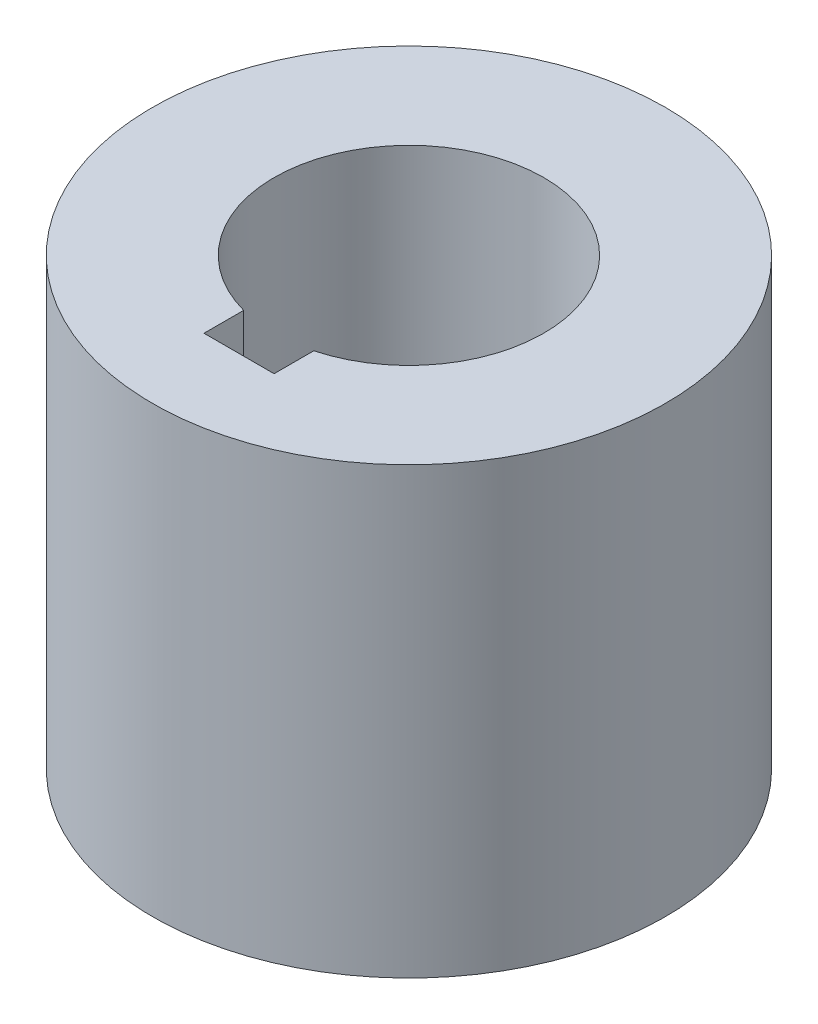
ISO-10303-21;
HEADER;
FILE_DESCRIPTION(('STEP AP214'),'2;1');
FILE_NAME('part.step','',(''),(''),'','','');
FILE_SCHEMA(('AUTOMOTIVE_DESIGN { 1 0 10303 214 1 1 1 1 }'));
ENDSEC;
DATA;
#1=APPLICATION_CONTEXT('core data for automotive mechanical design processes');
#2=APPLICATION_PROTOCOL_DEFINITION('international standard','automotive_design',2000,#1);
#3=PRODUCT_CONTEXT('',#1,'mechanical');
#4=PRODUCT('Part','Part','',(#3));
#5=PRODUCT_RELATED_PRODUCT_CATEGORY('part','',(#4));
#6=PRODUCT_DEFINITION_FORMATION('','',#4);
#7=PRODUCT_DEFINITION_CONTEXT('part definition',#1,'design');
#8=PRODUCT_DEFINITION('design','',#6,#7);
#9=PRODUCT_DEFINITION_SHAPE('','',#8);
#10=(LENGTH_UNIT() NAMED_UNIT(*) SI_UNIT(.MILLI.,.METRE.));
#11=(NAMED_UNIT(*) PLANE_ANGLE_UNIT() SI_UNIT($,.RADIAN.));
#12=(NAMED_UNIT(*) SI_UNIT($,.STERADIAN.) SOLID_ANGLE_UNIT());
#13=UNCERTAINTY_MEASURE_WITH_UNIT(LENGTH_MEASURE(1.E-05),#10,'distance_accuracy_value','');
#14=(GEOMETRIC_REPRESENTATION_CONTEXT(3) GLOBAL_UNCERTAINTY_ASSIGNED_CONTEXT((#13)) GLOBAL_UNIT_ASSIGNED_CONTEXT((#10,
#11,#12)) REPRESENTATION_CONTEXT('',''));
#15=CARTESIAN_POINT('',(0.,0.,0.));
#16=DIRECTION('',(0.,0.,1.));
#17=DIRECTION('',(1.,0.,0.));
#18=AXIS2_PLACEMENT_3D('',#15,#16,#17);
#19=CARTESIAN_POINT('',(-1.0414,12.0697859789974,5.04825000000001));
#20=DIRECTION('',(-1.,0.,0.));
#21=DIRECTION('',(0.,0.,1.));
#22=AXIS2_PLACEMENT_3D('',#19,#20,#21);
#23=PLANE('',#22);
#24=DIRECTION('',(0.,1.,0.));
#25=VECTOR('',#24,1.);
#26=CARTESIAN_POINT('',(-1.0414,12.0697859789974,5.04825000000001));
#27=LINE('',#26,#25);
#28=CARTESIAN_POINT('',(-1.0414,0.,5.04825000000001));
#29=VERTEX_POINT('',#28);
#30=CARTESIAN_POINT('',(-1.0414,-13.208,5.04825000000001));
#31=VERTEX_POINT('',#30);
#32=EDGE_CURVE('E60',#29,#31,#27,.F.);
#33=ORIENTED_EDGE('',*,*,#32,.T.);
#34=DIRECTION('',(0.,0.,1.));
#35=VECTOR('',#34,1.);
#36=CARTESIAN_POINT('',(-1.0414,-13.208,5.04825000000001));
#37=LINE('',#36,#35);
#38=CARTESIAN_POINT('',(-1.0414,-13.208,3.86915145251514));
#39=VERTEX_POINT('',#38);
#40=EDGE_CURVE('E55',#39,#31,#37,.T.);
#41=ORIENTED_EDGE('',*,*,#40,.F.);
#42=DIRECTION('',(0.,-1.,0.));
#43=VECTOR('',#42,1.);
#44=CARTESIAN_POINT('',(-1.0414,-13.208,3.86915145251514));
#45=LINE('',#44,#43);
#46=CARTESIAN_POINT('',(-1.0414,0.,3.86915145251514));
#47=VERTEX_POINT('',#46);
#48=EDGE_CURVE('E57',#39,#47,#45,.F.);
#49=ORIENTED_EDGE('',*,*,#48,.T.);
#50=DIRECTION('',(0.,0.,1.));
#51=VECTOR('',#50,1.);
#52=CARTESIAN_POINT('',(-1.0414,0.,5.04825000000001));
#53=LINE('',#52,#51);
#54=EDGE_CURVE('E65',#29,#47,#53,.F.);
#55=ORIENTED_EDGE('',*,*,#54,.F.);
#56=EDGE_LOOP('',(#33,#41,#49,#55));
#57=FACE_BOUND('',#56,.T.);
#58=ADVANCED_FACE('F17',(#57),#23,.F.);
#59=CARTESIAN_POINT('',(1.0414,12.0697859789974,0.));
#60=DIRECTION('',(1.,0.,0.));
#61=DIRECTION('',(0.,0.,-1.));
#62=AXIS2_PLACEMENT_3D('',#59,#60,#61);
#63=PLANE('',#62);
#64=DIRECTION('',(0.,-1.,0.));
#65=VECTOR('',#64,1.);
#66=CARTESIAN_POINT('',(1.0414,-13.208,3.86915145251514));
#67=LINE('',#66,#65);
#68=CARTESIAN_POINT('',(1.0414,0.,3.86915145251514));
#69=VERTEX_POINT('',#68);
#70=CARTESIAN_POINT('',(1.0414,-13.208,3.86915145251514));
#71=VERTEX_POINT('',#70);
#72=EDGE_CURVE('E72',#69,#71,#67,.T.);
#73=ORIENTED_EDGE('',*,*,#72,.T.);
#74=DIRECTION('',(0.,0.,-1.));
#75=VECTOR('',#74,1.);
#76=CARTESIAN_POINT('',(1.0414,-13.208,0.));
#77=LINE('',#76,#75);
#78=CARTESIAN_POINT('',(1.0414,-13.208,5.04825000000001));
#79=VERTEX_POINT('',#78);
#80=EDGE_CURVE('E76',#79,#71,#77,.T.);
#81=ORIENTED_EDGE('',*,*,#80,.F.);
#82=DIRECTION('',(0.,1.,0.));
#83=VECTOR('',#82,1.);
#84=CARTESIAN_POINT('',(1.0414,12.0697859789974,5.04825000000001));
#85=LINE('',#84,#83);
#86=CARTESIAN_POINT('',(1.0414,0.,5.04825000000001));
#87=VERTEX_POINT('',#86);
#88=EDGE_CURVE('E80',#79,#87,#85,.T.);
#89=ORIENTED_EDGE('',*,*,#88,.T.);
#90=DIRECTION('',(0.,0.,-1.));
#91=VECTOR('',#90,1.);
#92=CARTESIAN_POINT('',(1.0414,0.,0.));
#93=LINE('',#92,#91);
#94=EDGE_CURVE('E35',#69,#87,#93,.F.);
#95=ORIENTED_EDGE('',*,*,#94,.F.);
#96=EDGE_LOOP('',(#73,#81,#89,#95));
#97=FACE_BOUND('',#96,.T.);
#98=ADVANCED_FACE('F113',(#97),#63,.F.);
#99=CARTESIAN_POINT('',(0.,-13.208,0.));
#100=DIRECTION('',(0.,-1.,0.));
#101=DIRECTION('',(0.,0.,-1.));
#102=AXIS2_PLACEMENT_3D('',#99,#100,#101);
#103=CYLINDRICAL_SURFACE('',#102,4.00685);
#104=ORIENTED_EDGE('',*,*,#48,.F.);
#105=CARTESIAN_POINT('',(0.,-13.208,0.));
#106=DIRECTION('',(0.,-1.,0.));
#107=DIRECTION('',(0.,0.,-1.));
#108=AXIS2_PLACEMENT_3D('',#105,#106,#107);
#109=CIRCLE('',#108,4.00685);
#110=EDGE_CURVE('E20',#39,#71,#109,.T.);
#111=ORIENTED_EDGE('',*,*,#110,.T.);
#112=ORIENTED_EDGE('',*,*,#72,.F.);
#113=CARTESIAN_POINT('',(0.,0.,0.));
#114=DIRECTION('',(0.,-1.,0.));
#115=DIRECTION('',(0.,0.,-1.));
#116=AXIS2_PLACEMENT_3D('',#113,#114,#115);
#117=CIRCLE('',#116,4.00685);
#118=EDGE_CURVE('E71',#47,#69,#117,.T.);
#119=ORIENTED_EDGE('',*,*,#118,.F.);
#120=EDGE_LOOP('',(#104,#111,#112,#119));
#121=FACE_BOUND('',#120,.T.);
#122=ADVANCED_FACE('F69',(#121),#103,.F.);
#123=CARTESIAN_POINT('',(1.0414,12.0697859789974,5.04825000000001));
#124=DIRECTION('',(0.,0.,1.));
#125=DIRECTION('',(1.,0.,0.));
#126=AXIS2_PLACEMENT_3D('',#123,#124,#125);
#127=PLANE('',#126);
#128=ORIENTED_EDGE('',*,*,#88,.F.);
#129=DIRECTION('',(1.,0.,0.));
#130=VECTOR('',#129,1.);
#131=CARTESIAN_POINT('',(0.,-13.208,5.04825000000001));
#132=LINE('',#131,#130);
#133=EDGE_CURVE('E78',#79,#31,#132,.F.);
#134=ORIENTED_EDGE('',*,*,#133,.T.);
#135=ORIENTED_EDGE('',*,*,#32,.F.);
#136=DIRECTION('',(1.,0.,0.));
#137=VECTOR('',#136,1.);
#138=CARTESIAN_POINT('',(0.,0.,5.04825000000001));
#139=LINE('',#138,#137);
#140=EDGE_CURVE('E79',#87,#29,#139,.F.);
#141=ORIENTED_EDGE('',*,*,#140,.F.);
#142=EDGE_LOOP('',(#128,#134,#135,#141));
#143=FACE_BOUND('',#142,.T.);
#144=ADVANCED_FACE('F115',(#143),#127,.F.);
#145=CARTESIAN_POINT('',(0.,-13.208,0.));
#146=DIRECTION('',(0.,1.,0.));
#147=DIRECTION('',(0.,0.,1.));
#148=AXIS2_PLACEMENT_3D('',#145,#146,#147);
#149=PLANE('',#148);
#150=CARTESIAN_POINT('',(0.,-13.208,0.));
#151=DIRECTION('',(0.,-1.,0.));
#152=DIRECTION('',(0.,0.,-1.));
#153=AXIS2_PLACEMENT_3D('',#150,#151,#152);
#154=CIRCLE('',#153,7.62);
#155=CARTESIAN_POINT('',(0.,-13.208,-7.62));
#156=VERTEX_POINT('',#155);
#157=EDGE_CURVE('E26',#156,#156,#154,.F.);
#158=ORIENTED_EDGE('',*,*,#157,.F.);
#159=EDGE_LOOP('',(#158));
#160=FACE_BOUND('',#159,.T.);
#161=ORIENTED_EDGE('',*,*,#40,.T.);
#162=ORIENTED_EDGE('',*,*,#133,.F.);
#163=ORIENTED_EDGE('',*,*,#80,.T.);
#164=ORIENTED_EDGE('',*,*,#110,.F.);
#165=EDGE_LOOP('',(#161,#162,#163,#164));
#166=FACE_BOUND('',#165,.T.);
#167=ADVANCED_FACE('F75',(#160,#166),#149,.F.);
#168=CARTESIAN_POINT('',(0.,0.,0.));
#169=DIRECTION('',(0.,1.,0.));
#170=DIRECTION('',(0.,0.,1.));
#171=AXIS2_PLACEMENT_3D('',#168,#169,#170);
#172=PLANE('',#171);
#173=CARTESIAN_POINT('',(0.,0.,0.));
#174=DIRECTION('',(0.,-1.,0.));
#175=DIRECTION('',(0.,0.,-1.));
#176=AXIS2_PLACEMENT_3D('',#173,#174,#175);
#177=CIRCLE('',#176,7.62);
#178=CARTESIAN_POINT('',(0.,0.,-7.62));
#179=VERTEX_POINT('',#178);
#180=EDGE_CURVE('E11',#179,#179,#177,.T.);
#181=ORIENTED_EDGE('',*,*,#180,.F.);
#182=EDGE_LOOP('',(#181));
#183=FACE_BOUND('',#182,.T.);
#184=ORIENTED_EDGE('',*,*,#94,.T.);
#185=ORIENTED_EDGE('',*,*,#140,.T.);
#186=ORIENTED_EDGE('',*,*,#54,.T.);
#187=ORIENTED_EDGE('',*,*,#118,.T.);
#188=EDGE_LOOP('',(#184,#185,#186,#187));
#189=FACE_BOUND('',#188,.T.);
#190=ADVANCED_FACE('F114',(#183,#189),#172,.T.);
#191=CARTESIAN_POINT('',(0.,-13.208,0.));
#192=DIRECTION('',(0.,-1.,0.));
#193=DIRECTION('',(0.,0.,-1.));
#194=AXIS2_PLACEMENT_3D('',#191,#192,#193);
#195=CYLINDRICAL_SURFACE('',#194,7.62);
#196=ORIENTED_EDGE('',*,*,#180,.T.);
#197=EDGE_LOOP('',(#196));
#198=FACE_BOUND('',#197,.T.);
#199=ORIENTED_EDGE('',*,*,#157,.T.);
#200=EDGE_LOOP('',(#199));
#201=FACE_BOUND('',#200,.T.);
#202=ADVANCED_FACE('F126',(#198,#201),#195,.T.);
#203=CLOSED_SHELL('',(#58,#98,#122,#144,#167,#190,#202));
#204=MANIFOLD_SOLID_BREP('B1',#203);
#205=ADVANCED_BREP_SHAPE_REPRESENTATION('',(#18,#204),#14);
#206=SHAPE_DEFINITION_REPRESENTATION(#9,#205);
ENDSEC;
END-ISO-10303-21;
